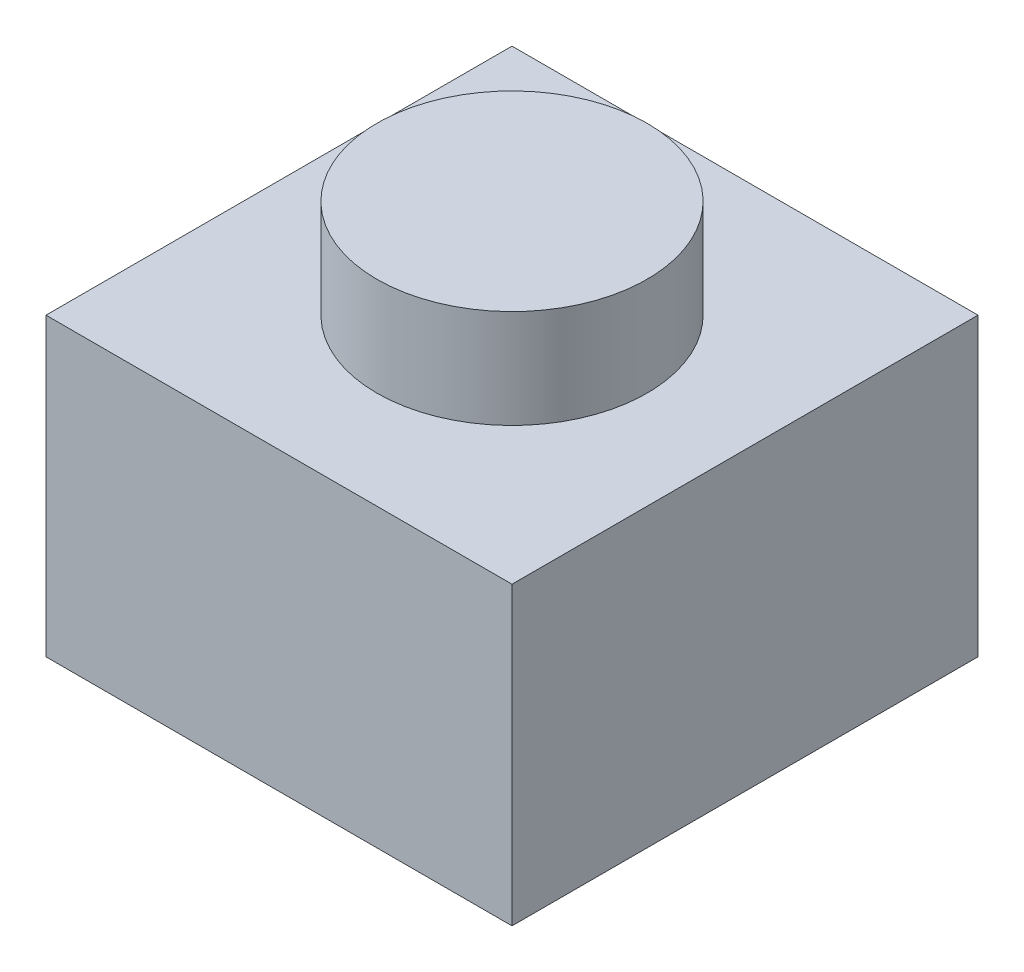
ISO-10303-21;
HEADER;
FILE_DESCRIPTION(('STEP AP214'),'2;1');
FILE_NAME('part.step','',(''),(''),'','','');
FILE_SCHEMA(('AUTOMOTIVE_DESIGN { 1 0 10303 214 1 1 1 1 }'));
ENDSEC;
DATA;
#1=APPLICATION_CONTEXT('core data for automotive mechanical design processes');
#2=APPLICATION_PROTOCOL_DEFINITION('international standard','automotive_design',2000,#1);
#3=PRODUCT_CONTEXT('',#1,'mechanical');
#4=PRODUCT('Part','Part','',(#3));
#5=PRODUCT_RELATED_PRODUCT_CATEGORY('part','',(#4));
#6=PRODUCT_DEFINITION_FORMATION('','',#4);
#7=PRODUCT_DEFINITION_CONTEXT('part definition',#1,'design');
#8=PRODUCT_DEFINITION('design','',#6,#7);
#9=PRODUCT_DEFINITION_SHAPE('','',#8);
#10=(LENGTH_UNIT() NAMED_UNIT(*) SI_UNIT(.MILLI.,.METRE.));
#11=(NAMED_UNIT(*) PLANE_ANGLE_UNIT() SI_UNIT($,.RADIAN.));
#12=(NAMED_UNIT(*) SI_UNIT($,.STERADIAN.) SOLID_ANGLE_UNIT());
#13=UNCERTAINTY_MEASURE_WITH_UNIT(LENGTH_MEASURE(1.E-05),#10,'distance_accuracy_value','');
#14=(GEOMETRIC_REPRESENTATION_CONTEXT(3) GLOBAL_UNCERTAINTY_ASSIGNED_CONTEXT((#13)) GLOBAL_UNIT_ASSIGNED_CONTEXT((#10,
#11,#12)) REPRESENTATION_CONTEXT('',''));
#15=CARTESIAN_POINT('',(0.,0.,0.));
#16=DIRECTION('',(0.,0.,1.));
#17=DIRECTION('',(1.,0.,0.));
#18=AXIS2_PLACEMENT_3D('',#15,#16,#17);
#19=CARTESIAN_POINT('',(3.,3.81,3.));
#20=DIRECTION('',(-1.,0.,0.));
#21=DIRECTION('',(0.,0.,1.));
#22=AXIS2_PLACEMENT_3D('',#19,#20,#21);
#23=PLANE('',#22);
#24=DIRECTION('',(0.,0.,-1.));
#25=VECTOR('',#24,1.);
#26=CARTESIAN_POINT('',(3.,0.,3.));
#27=LINE('',#26,#25);
#28=CARTESIAN_POINT('',(3.,0.,3.));
#29=VERTEX_POINT('',#28);
#30=CARTESIAN_POINT('',(3.,0.,-3.));
#31=VERTEX_POINT('',#30);
#32=EDGE_CURVE('E99',#29,#31,#27,.T.);
#33=ORIENTED_EDGE('',*,*,#32,.T.);
#34=DIRECTION('',(0.,-1.,0.));
#35=VECTOR('',#34,1.);
#36=CARTESIAN_POINT('',(3.,3.81,-3.));
#37=LINE('',#36,#35);
#38=CARTESIAN_POINT('',(3.,3.81,-3.));
#39=VERTEX_POINT('',#38);
#40=EDGE_CURVE('E36',#39,#31,#37,.T.);
#41=ORIENTED_EDGE('',*,*,#40,.F.);
#42=DIRECTION('',(0.,0.,-1.));
#43=VECTOR('',#42,1.);
#44=CARTESIAN_POINT('',(3.,3.81,3.));
#45=LINE('',#44,#43);
#46=CARTESIAN_POINT('',(3.,3.81,3.));
#47=VERTEX_POINT('',#46);
#48=EDGE_CURVE('E86',#47,#39,#45,.T.);
#49=ORIENTED_EDGE('',*,*,#48,.F.);
#50=DIRECTION('',(0.,-1.,0.));
#51=VECTOR('',#50,1.);
#52=CARTESIAN_POINT('',(3.,3.81,3.));
#53=LINE('',#52,#51);
#54=EDGE_CURVE('E95',#47,#29,#53,.T.);
#55=ORIENTED_EDGE('',*,*,#54,.T.);
#56=EDGE_LOOP('',(#33,#41,#49,#55));
#57=FACE_BOUND('',#56,.T.);
#58=ADVANCED_FACE('F33',(#57),#23,.F.);
#59=CARTESIAN_POINT('',(-3.,3.81,-3.));
#60=DIRECTION('',(0.,0.,1.));
#61=DIRECTION('',(1.,0.,0.));
#62=AXIS2_PLACEMENT_3D('',#59,#60,#61);
#63=PLANE('',#62);
#64=DIRECTION('',(-1.,0.,0.));
#65=VECTOR('',#64,1.);
#66=CARTESIAN_POINT('',(-3.,0.,-3.));
#67=LINE('',#66,#65);
#68=CARTESIAN_POINT('',(-3.,0.,-3.));
#69=VERTEX_POINT('',#68);
#70=EDGE_CURVE('E91',#31,#69,#67,.T.);
#71=ORIENTED_EDGE('',*,*,#70,.T.);
#72=DIRECTION('',(0.,-1.,0.));
#73=VECTOR('',#72,1.);
#74=CARTESIAN_POINT('',(-3.,3.81,-3.));
#75=LINE('',#74,#73);
#76=CARTESIAN_POINT('',(-3.,3.81,-3.));
#77=VERTEX_POINT('',#76);
#78=EDGE_CURVE('E89',#77,#69,#75,.T.);
#79=ORIENTED_EDGE('',*,*,#78,.F.);
#80=DIRECTION('',(-1.,0.,0.));
#81=VECTOR('',#80,1.);
#82=CARTESIAN_POINT('',(-3.,3.81,-3.));
#83=LINE('',#82,#81);
#84=EDGE_CURVE('E81',#39,#77,#83,.T.);
#85=ORIENTED_EDGE('',*,*,#84,.F.);
#86=ORIENTED_EDGE('',*,*,#40,.T.);
#87=EDGE_LOOP('',(#71,#79,#85,#86));
#88=FACE_BOUND('',#87,.T.);
#89=ADVANCED_FACE('F90',(#88),#63,.F.);
#90=CARTESIAN_POINT('',(-3.,3.81,3.));
#91=DIRECTION('',(1.,0.,0.));
#92=DIRECTION('',(0.,0.,-1.));
#93=AXIS2_PLACEMENT_3D('',#90,#91,#92);
#94=PLANE('',#93);
#95=DIRECTION('',(0.,0.,1.));
#96=VECTOR('',#95,1.);
#97=CARTESIAN_POINT('',(-3.,0.,3.));
#98=LINE('',#97,#96);
#99=CARTESIAN_POINT('',(-3.,0.,3.));
#100=VERTEX_POINT('',#99);
#101=EDGE_CURVE('E67',#69,#100,#98,.T.);
#102=ORIENTED_EDGE('',*,*,#101,.T.);
#103=DIRECTION('',(0.,-1.,0.));
#104=VECTOR('',#103,1.);
#105=CARTESIAN_POINT('',(-3.,3.81,3.));
#106=LINE('',#105,#104);
#107=CARTESIAN_POINT('',(-3.,3.81,3.));
#108=VERTEX_POINT('',#107);
#109=EDGE_CURVE('E92',#108,#100,#106,.T.);
#110=ORIENTED_EDGE('',*,*,#109,.F.);
#111=DIRECTION('',(0.,0.,1.));
#112=VECTOR('',#111,1.);
#113=CARTESIAN_POINT('',(-3.,3.81,3.));
#114=LINE('',#113,#112);
#115=EDGE_CURVE('E84',#77,#108,#114,.T.);
#116=ORIENTED_EDGE('',*,*,#115,.F.);
#117=ORIENTED_EDGE('',*,*,#78,.T.);
#118=EDGE_LOOP('',(#102,#110,#116,#117));
#119=FACE_BOUND('',#118,.T.);
#120=ADVANCED_FACE('F93',(#119),#94,.F.);
#121=CARTESIAN_POINT('',(-3.,3.81,3.));
#122=DIRECTION('',(0.,0.,-1.));
#123=DIRECTION('',(-1.,0.,0.));
#124=AXIS2_PLACEMENT_3D('',#121,#122,#123);
#125=PLANE('',#124);
#126=DIRECTION('',(1.,0.,0.));
#127=VECTOR('',#126,1.);
#128=CARTESIAN_POINT('',(-3.,0.,3.));
#129=LINE('',#128,#127);
#130=EDGE_CURVE('E73',#100,#29,#129,.T.);
#131=ORIENTED_EDGE('',*,*,#130,.T.);
#132=ORIENTED_EDGE('',*,*,#54,.F.);
#133=DIRECTION('',(1.,0.,0.));
#134=VECTOR('',#133,1.);
#135=CARTESIAN_POINT('',(-3.,3.81,3.));
#136=LINE('',#135,#134);
#137=EDGE_CURVE('E50',#108,#47,#136,.T.);
#138=ORIENTED_EDGE('',*,*,#137,.F.);
#139=ORIENTED_EDGE('',*,*,#109,.T.);
#140=EDGE_LOOP('',(#131,#132,#138,#139));
#141=FACE_BOUND('',#140,.T.);
#142=ADVANCED_FACE('F107',(#141),#125,.F.);
#143=CARTESIAN_POINT('',(0.,3.81,0.));
#144=DIRECTION('',(0.,-1.,0.));
#145=DIRECTION('',(0.,0.,-1.));
#146=AXIS2_PLACEMENT_3D('',#143,#144,#145);
#147=PLANE('',#146);
#148=CARTESIAN_POINT('',(0.,3.81,0.));
#149=DIRECTION('',(0.,1.,0.));
#150=DIRECTION('',(0.,0.,1.));
#151=AXIS2_PLACEMENT_3D('',#148,#149,#150);
#152=CIRCLE('',#151,1.7399);
#153=CARTESIAN_POINT('',(0.,3.81,1.7399));
#154=VERTEX_POINT('',#153);
#155=EDGE_CURVE('E11',#154,#154,#152,.T.);
#156=ORIENTED_EDGE('',*,*,#155,.F.);
#157=EDGE_LOOP('',(#156));
#158=FACE_BOUND('',#157,.T.);
#159=ORIENTED_EDGE('',*,*,#48,.T.);
#160=ORIENTED_EDGE('',*,*,#84,.T.);
#161=ORIENTED_EDGE('',*,*,#115,.T.);
#162=ORIENTED_EDGE('',*,*,#137,.T.);
#163=EDGE_LOOP('',(#159,#160,#161,#162));
#164=FACE_BOUND('',#163,.T.);
#165=ADVANCED_FACE('F82',(#158,#164),#147,.F.);
#166=CARTESIAN_POINT('',(0.,0.,0.));
#167=DIRECTION('',(0.,-1.,0.));
#168=DIRECTION('',(0.,0.,-1.));
#169=AXIS2_PLACEMENT_3D('',#166,#167,#168);
#170=PLANE('',#169);
#171=ORIENTED_EDGE('',*,*,#32,.F.);
#172=ORIENTED_EDGE('',*,*,#130,.F.);
#173=ORIENTED_EDGE('',*,*,#101,.F.);
#174=ORIENTED_EDGE('',*,*,#70,.F.);
#175=EDGE_LOOP('',(#171,#172,#173,#174));
#176=FACE_BOUND('',#175,.T.);
#177=ADVANCED_FACE('F110',(#176),#170,.T.);
#178=CARTESIAN_POINT('',(0.,5.08,0.));
#179=DIRECTION('',(0.,-1.,0.));
#180=DIRECTION('',(0.,0.,-1.));
#181=AXIS2_PLACEMENT_3D('',#178,#179,#180);
#182=CYLINDRICAL_SURFACE('',#181,1.7399);
#183=CARTESIAN_POINT('',(0.,5.08,0.));
#184=DIRECTION('',(0.,1.,0.));
#185=DIRECTION('',(0.,0.,1.));
#186=AXIS2_PLACEMENT_3D('',#183,#184,#185);
#187=CIRCLE('',#186,1.7399);
#188=CARTESIAN_POINT('',(0.,5.08,1.7399));
#189=VERTEX_POINT('',#188);
#190=EDGE_CURVE('E102',#189,#189,#187,.T.);
#191=ORIENTED_EDGE('',*,*,#190,.F.);
#192=EDGE_LOOP('',(#191));
#193=FACE_BOUND('',#192,.T.);
#194=ORIENTED_EDGE('',*,*,#155,.T.);
#195=EDGE_LOOP('',(#194));
#196=FACE_BOUND('',#195,.T.);
#197=ADVANCED_FACE('F118',(#193,#196),#182,.T.);
#198=CARTESIAN_POINT('',(0.,5.08,0.));
#199=DIRECTION('',(0.,1.,0.));
#200=DIRECTION('',(0.,0.,1.));
#201=AXIS2_PLACEMENT_3D('',#198,#199,#200);
#202=PLANE('',#201);
#203=ORIENTED_EDGE('',*,*,#190,.T.);
#204=EDGE_LOOP('',(#203));
#205=FACE_BOUND('',#204,.T.);
#206=ADVANCED_FACE('F116',(#205),#202,.T.);
#207=CLOSED_SHELL('',(#58,#89,#120,#142,#165,#177,#197,#206));
#208=MANIFOLD_SOLID_BREP('B2',#207);
#209=ADVANCED_BREP_SHAPE_REPRESENTATION('',(#18,#208),#14);
#210=SHAPE_DEFINITION_REPRESENTATION(#9,#209);
ENDSEC;
END-ISO-10303-21;
